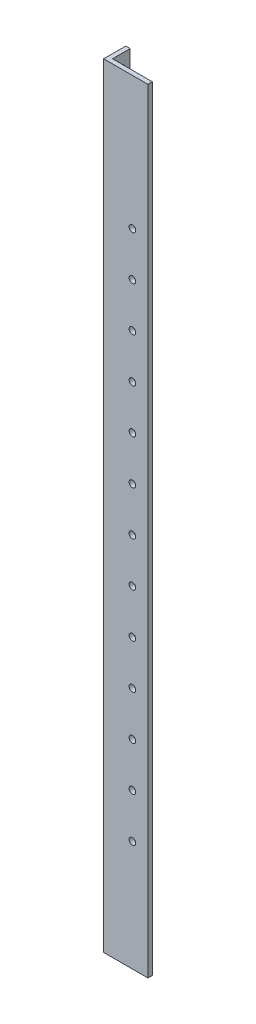
ISO-10303-21;
HEADER;
FILE_DESCRIPTION(('STEP AP214'),'2;1');
FILE_NAME('part.step','',(''),(''),'','','');
FILE_SCHEMA(('AUTOMOTIVE_DESIGN { 1 0 10303 214 1 1 1 1 }'));
ENDSEC;
DATA;
#1=APPLICATION_CONTEXT('core data for automotive mechanical design processes');
#2=APPLICATION_PROTOCOL_DEFINITION('international standard','automotive_design',2000,#1);
#3=PRODUCT_CONTEXT('',#1,'mechanical');
#4=PRODUCT('Part','Part','',(#3));
#5=PRODUCT_RELATED_PRODUCT_CATEGORY('part','',(#4));
#6=PRODUCT_DEFINITION_FORMATION('','',#4);
#7=PRODUCT_DEFINITION_CONTEXT('part definition',#1,'design');
#8=PRODUCT_DEFINITION('design','',#6,#7);
#9=PRODUCT_DEFINITION_SHAPE('','',#8);
#10=(LENGTH_UNIT() NAMED_UNIT(*) SI_UNIT(.MILLI.,.METRE.));
#11=(NAMED_UNIT(*) PLANE_ANGLE_UNIT() SI_UNIT($,.RADIAN.));
#12=(NAMED_UNIT(*) SI_UNIT($,.STERADIAN.) SOLID_ANGLE_UNIT());
#13=UNCERTAINTY_MEASURE_WITH_UNIT(LENGTH_MEASURE(1.E-05),#10,'distance_accuracy_value','');
#14=(GEOMETRIC_REPRESENTATION_CONTEXT(3) GLOBAL_UNCERTAINTY_ASSIGNED_CONTEXT((#13)) GLOBAL_UNIT_ASSIGNED_CONTEXT((#10,
#11,#12)) REPRESENTATION_CONTEXT('',''));
#15=CARTESIAN_POINT('',(0.,0.,0.));
#16=DIRECTION('',(0.,0.,1.));
#17=DIRECTION('',(1.,0.,0.));
#18=AXIS2_PLACEMENT_3D('',#15,#16,#17);
#19=CARTESIAN_POINT('',(20.,350.,0.));
#20=DIRECTION('',(0.,0.,-1.));
#21=DIRECTION('',(-1.,0.,0.));
#22=AXIS2_PLACEMENT_3D('',#19,#20,#21);
#23=PLANE('',#22);
#24=CARTESIAN_POINT('',(12.9999999863213,50.,0.));
#25=DIRECTION('',(0.,0.,1.));
#26=DIRECTION('',(1.,0.,0.));
#27=AXIS2_PLACEMENT_3D('',#24,#25,#26);
#28=CIRCLE('',#27,1.5);
#29=CARTESIAN_POINT('',(14.4999999863213,50.,0.));
#30=VERTEX_POINT('',#29);
#31=EDGE_CURVE('E243',#30,#30,#28,.T.);
#32=ORIENTED_EDGE('',*,*,#31,.F.);
#33=EDGE_LOOP('',(#32));
#34=FACE_BOUND('',#33,.T.);
#35=CARTESIAN_POINT('',(12.9999999863213,70.,0.));
#36=DIRECTION('',(0.,0.,1.));
#37=DIRECTION('',(1.,0.,0.));
#38=AXIS2_PLACEMENT_3D('',#35,#36,#37);
#39=CIRCLE('',#38,1.5);
#40=CARTESIAN_POINT('',(14.4999999863213,70.,0.));
#41=VERTEX_POINT('',#40);
#42=EDGE_CURVE('E247',#41,#41,#39,.T.);
#43=ORIENTED_EDGE('',*,*,#42,.F.);
#44=EDGE_LOOP('',(#43));
#45=FACE_BOUND('',#44,.T.);
#46=CARTESIAN_POINT('',(12.9999999863213,90.0000000000001,0.));
#47=DIRECTION('',(0.,0.,1.));
#48=DIRECTION('',(1.,0.,0.));
#49=AXIS2_PLACEMENT_3D('',#46,#47,#48);
#50=CIRCLE('',#49,1.5);
#51=CARTESIAN_POINT('',(14.4999999863213,90.0000000000001,0.));
#52=VERTEX_POINT('',#51);
#53=EDGE_CURVE('E251',#52,#52,#50,.T.);
#54=ORIENTED_EDGE('',*,*,#53,.F.);
#55=EDGE_LOOP('',(#54));
#56=FACE_BOUND('',#55,.T.);
#57=CARTESIAN_POINT('',(12.9999999863213,130.,0.));
#58=DIRECTION('',(0.,0.,1.));
#59=DIRECTION('',(1.,0.,0.));
#60=AXIS2_PLACEMENT_3D('',#57,#58,#59);
#61=CIRCLE('',#60,1.5);
#62=CARTESIAN_POINT('',(14.4999999863213,130.,0.));
#63=VERTEX_POINT('',#62);
#64=EDGE_CURVE('E255',#63,#63,#61,.T.);
#65=ORIENTED_EDGE('',*,*,#64,.F.);
#66=EDGE_LOOP('',(#65));
#67=FACE_BOUND('',#66,.T.);
#68=CARTESIAN_POINT('',(12.9999999863213,190.,0.));
#69=DIRECTION('',(0.,0.,1.));
#70=DIRECTION('',(1.,0.,0.));
#71=AXIS2_PLACEMENT_3D('',#68,#69,#70);
#72=CIRCLE('',#71,1.5);
#73=CARTESIAN_POINT('',(14.4999999863213,190.,0.));
#74=VERTEX_POINT('',#73);
#75=EDGE_CURVE('E259',#74,#74,#72,.T.);
#76=ORIENTED_EDGE('',*,*,#75,.F.);
#77=EDGE_LOOP('',(#76));
#78=FACE_BOUND('',#77,.T.);
#79=CARTESIAN_POINT('',(12.9999999863213,110.,0.));
#80=DIRECTION('',(0.,0.,1.));
#81=DIRECTION('',(1.,0.,0.));
#82=AXIS2_PLACEMENT_3D('',#79,#80,#81);
#83=CIRCLE('',#82,1.5);
#84=CARTESIAN_POINT('',(14.4999999863213,110.,0.));
#85=VERTEX_POINT('',#84);
#86=EDGE_CURVE('E263',#85,#85,#83,.T.);
#87=ORIENTED_EDGE('',*,*,#86,.F.);
#88=EDGE_LOOP('',(#87));
#89=FACE_BOUND('',#88,.T.);
#90=CARTESIAN_POINT('',(12.9999999863213,150.,0.));
#91=DIRECTION('',(0.,0.,1.));
#92=DIRECTION('',(1.,0.,0.));
#93=AXIS2_PLACEMENT_3D('',#90,#91,#92);
#94=CIRCLE('',#93,1.5);
#95=CARTESIAN_POINT('',(14.4999999863213,150.,0.));
#96=VERTEX_POINT('',#95);
#97=EDGE_CURVE('E188',#96,#96,#94,.T.);
#98=ORIENTED_EDGE('',*,*,#97,.F.);
#99=EDGE_LOOP('',(#98));
#100=FACE_BOUND('',#99,.T.);
#101=CARTESIAN_POINT('',(12.9999999863213,170.,0.));
#102=DIRECTION('',(0.,0.,1.));
#103=DIRECTION('',(1.,0.,0.));
#104=AXIS2_PLACEMENT_3D('',#101,#102,#103);
#105=CIRCLE('',#104,1.5);
#106=CARTESIAN_POINT('',(14.4999999863213,170.,0.));
#107=VERTEX_POINT('',#106);
#108=EDGE_CURVE('E270',#107,#107,#105,.T.);
#109=ORIENTED_EDGE('',*,*,#108,.F.);
#110=EDGE_LOOP('',(#109));
#111=FACE_BOUND('',#110,.T.);
#112=CARTESIAN_POINT('',(12.9999999863213,210.,0.));
#113=DIRECTION('',(0.,0.,1.));
#114=DIRECTION('',(1.,0.,0.));
#115=AXIS2_PLACEMENT_3D('',#112,#113,#114);
#116=CIRCLE('',#115,1.5);
#117=CARTESIAN_POINT('',(14.4999999863213,210.,0.));
#118=VERTEX_POINT('',#117);
#119=EDGE_CURVE('E274',#118,#118,#116,.T.);
#120=ORIENTED_EDGE('',*,*,#119,.F.);
#121=EDGE_LOOP('',(#120));
#122=FACE_BOUND('',#121,.T.);
#123=CARTESIAN_POINT('',(12.9999999863213,230.,0.));
#124=DIRECTION('',(0.,0.,1.));
#125=DIRECTION('',(1.,0.,0.));
#126=AXIS2_PLACEMENT_3D('',#123,#124,#125);
#127=CIRCLE('',#126,1.5);
#128=CARTESIAN_POINT('',(14.4999999863213,230.,0.));
#129=VERTEX_POINT('',#128);
#130=EDGE_CURVE('E278',#129,#129,#127,.T.);
#131=ORIENTED_EDGE('',*,*,#130,.F.);
#132=EDGE_LOOP('',(#131));
#133=FACE_BOUND('',#132,.T.);
#134=CARTESIAN_POINT('',(12.9999999863213,250.,0.));
#135=DIRECTION('',(0.,0.,1.));
#136=DIRECTION('',(1.,0.,0.));
#137=AXIS2_PLACEMENT_3D('',#134,#135,#136);
#138=CIRCLE('',#137,1.5);
#139=CARTESIAN_POINT('',(14.4999999863213,250.,0.));
#140=VERTEX_POINT('',#139);
#141=EDGE_CURVE('E282',#140,#140,#138,.T.);
#142=ORIENTED_EDGE('',*,*,#141,.F.);
#143=EDGE_LOOP('',(#142));
#144=FACE_BOUND('',#143,.T.);
#145=CARTESIAN_POINT('',(12.9999999863213,270.,0.));
#146=DIRECTION('',(0.,0.,1.));
#147=DIRECTION('',(1.,0.,0.));
#148=AXIS2_PLACEMENT_3D('',#145,#146,#147);
#149=CIRCLE('',#148,1.5);
#150=CARTESIAN_POINT('',(14.4999999863213,270.,0.));
#151=VERTEX_POINT('',#150);
#152=EDGE_CURVE('E149',#151,#151,#149,.T.);
#153=ORIENTED_EDGE('',*,*,#152,.F.);
#154=EDGE_LOOP('',(#153));
#155=FACE_BOUND('',#154,.T.);
#156=CARTESIAN_POINT('',(12.9999999863213,290.,0.));
#157=DIRECTION('',(0.,0.,1.));
#158=DIRECTION('',(1.,0.,0.));
#159=AXIS2_PLACEMENT_3D('',#156,#157,#158);
#160=CIRCLE('',#159,1.5);
#161=CARTESIAN_POINT('',(14.4999999863213,290.,0.));
#162=VERTEX_POINT('',#161);
#163=EDGE_CURVE('E144',#162,#162,#160,.T.);
#164=ORIENTED_EDGE('',*,*,#163,.F.);
#165=EDGE_LOOP('',(#164));
#166=FACE_BOUND('',#165,.T.);
#167=DIRECTION('',(1.,0.,0.));
#168=VECTOR('',#167,1.);
#169=CARTESIAN_POINT('',(20.,0.,0.));
#170=LINE('',#169,#168);
#171=CARTESIAN_POINT('',(0.,0.,0.));
#172=VERTEX_POINT('',#171);
#173=CARTESIAN_POINT('',(20.,0.,0.));
#174=VERTEX_POINT('',#173);
#175=EDGE_CURVE('E123',#172,#174,#170,.T.);
#176=ORIENTED_EDGE('',*,*,#175,.T.);
#177=DIRECTION('',(0.,-1.,0.));
#178=VECTOR('',#177,1.);
#179=CARTESIAN_POINT('',(20.,350.,0.));
#180=LINE('',#179,#178);
#181=CARTESIAN_POINT('',(20.,350.,0.));
#182=VERTEX_POINT('',#181);
#183=EDGE_CURVE('E11',#182,#174,#180,.T.);
#184=ORIENTED_EDGE('',*,*,#183,.F.);
#185=DIRECTION('',(1.,0.,0.));
#186=VECTOR('',#185,1.);
#187=CARTESIAN_POINT('',(20.,350.,0.));
#188=LINE('',#187,#186);
#189=CARTESIAN_POINT('',(0.,350.,0.));
#190=VERTEX_POINT('',#189);
#191=EDGE_CURVE('E134',#190,#182,#188,.T.);
#192=ORIENTED_EDGE('',*,*,#191,.F.);
#193=DIRECTION('',(0.,-1.,0.));
#194=VECTOR('',#193,1.);
#195=CARTESIAN_POINT('',(0.,350.,0.));
#196=LINE('',#195,#194);
#197=EDGE_CURVE('E119',#190,#172,#196,.T.);
#198=ORIENTED_EDGE('',*,*,#197,.T.);
#199=EDGE_LOOP('',(#176,#184,#192,#198));
#200=FACE_BOUND('',#199,.T.);
#201=ADVANCED_FACE('F37',(#34,#45,#56,#67,#78,#89,#100,#111,#122,#133,#144,#155,#166,#200),#23,.F.);
#202=CARTESIAN_POINT('',(20.,350.,-2.));
#203=DIRECTION('',(-1.,0.,0.));
#204=DIRECTION('',(0.,0.,1.));
#205=AXIS2_PLACEMENT_3D('',#202,#203,#204);
#206=PLANE('',#205);
#207=DIRECTION('',(0.,0.,-1.));
#208=VECTOR('',#207,1.);
#209=CARTESIAN_POINT('',(20.,0.,-2.));
#210=LINE('',#209,#208);
#211=CARTESIAN_POINT('',(20.,0.,-2.));
#212=VERTEX_POINT('',#211);
#213=EDGE_CURVE('E126',#174,#212,#210,.T.);
#214=ORIENTED_EDGE('',*,*,#213,.T.);
#215=DIRECTION('',(0.,-1.,0.));
#216=VECTOR('',#215,1.);
#217=CARTESIAN_POINT('',(20.,350.,-2.));
#218=LINE('',#217,#216);
#219=CARTESIAN_POINT('',(20.,350.,-2.));
#220=VERTEX_POINT('',#219);
#221=EDGE_CURVE('E46',#220,#212,#218,.T.);
#222=ORIENTED_EDGE('',*,*,#221,.F.);
#223=DIRECTION('',(0.,0.,-1.));
#224=VECTOR('',#223,1.);
#225=CARTESIAN_POINT('',(20.,350.,-2.));
#226=LINE('',#225,#224);
#227=EDGE_CURVE('E92',#182,#220,#226,.T.);
#228=ORIENTED_EDGE('',*,*,#227,.F.);
#229=ORIENTED_EDGE('',*,*,#183,.T.);
#230=EDGE_LOOP('',(#214,#222,#228,#229));
#231=FACE_BOUND('',#230,.T.);
#232=ADVANCED_FACE('F215',(#231),#206,.F.);
#233=CARTESIAN_POINT('',(2.,350.,-2.));
#234=DIRECTION('',(0.,0.,1.));
#235=DIRECTION('',(1.,0.,0.));
#236=AXIS2_PLACEMENT_3D('',#233,#234,#235);
#237=PLANE('',#236);
#238=CARTESIAN_POINT('',(12.9999999863213,50.,-2.));
#239=DIRECTION('',(0.,0.,1.));
#240=DIRECTION('',(1.,0.,0.));
#241=AXIS2_PLACEMENT_3D('',#238,#239,#240);
#242=CIRCLE('',#241,1.5);
#243=CARTESIAN_POINT('',(14.4999999863213,50.,-2.));
#244=VERTEX_POINT('',#243);
#245=EDGE_CURVE('E40',#244,#244,#242,.T.);
#246=ORIENTED_EDGE('',*,*,#245,.T.);
#247=EDGE_LOOP('',(#246));
#248=FACE_BOUND('',#247,.T.);
#249=CARTESIAN_POINT('',(12.9999999863213,70.,-2.));
#250=DIRECTION('',(0.,0.,1.));
#251=DIRECTION('',(1.,0.,0.));
#252=AXIS2_PLACEMENT_3D('',#249,#250,#251);
#253=CIRCLE('',#252,1.5);
#254=CARTESIAN_POINT('',(14.4999999863213,70.,-2.));
#255=VERTEX_POINT('',#254);
#256=EDGE_CURVE('E175',#255,#255,#253,.T.);
#257=ORIENTED_EDGE('',*,*,#256,.T.);
#258=EDGE_LOOP('',(#257));
#259=FACE_BOUND('',#258,.T.);
#260=CARTESIAN_POINT('',(12.9999999863213,90.0000000000001,-2.));
#261=DIRECTION('',(0.,0.,1.));
#262=DIRECTION('',(1.,0.,0.));
#263=AXIS2_PLACEMENT_3D('',#260,#261,#262);
#264=CIRCLE('',#263,1.5);
#265=CARTESIAN_POINT('',(14.4999999863213,90.0000000000001,-2.));
#266=VERTEX_POINT('',#265);
#267=EDGE_CURVE('E173',#266,#266,#264,.T.);
#268=ORIENTED_EDGE('',*,*,#267,.T.);
#269=EDGE_LOOP('',(#268));
#270=FACE_BOUND('',#269,.T.);
#271=CARTESIAN_POINT('',(12.9999999863213,130.,-2.));
#272=DIRECTION('',(0.,0.,1.));
#273=DIRECTION('',(1.,0.,0.));
#274=AXIS2_PLACEMENT_3D('',#271,#272,#273);
#275=CIRCLE('',#274,1.5);
#276=CARTESIAN_POINT('',(14.4999999863213,130.,-2.));
#277=VERTEX_POINT('',#276);
#278=EDGE_CURVE('E170',#277,#277,#275,.T.);
#279=ORIENTED_EDGE('',*,*,#278,.T.);
#280=EDGE_LOOP('',(#279));
#281=FACE_BOUND('',#280,.T.);
#282=CARTESIAN_POINT('',(12.9999999863213,190.,-2.));
#283=DIRECTION('',(0.,0.,1.));
#284=DIRECTION('',(1.,0.,0.));
#285=AXIS2_PLACEMENT_3D('',#282,#283,#284);
#286=CIRCLE('',#285,1.5);
#287=CARTESIAN_POINT('',(14.4999999863213,190.,-2.));
#288=VERTEX_POINT('',#287);
#289=EDGE_CURVE('E167',#288,#288,#286,.T.);
#290=ORIENTED_EDGE('',*,*,#289,.T.);
#291=EDGE_LOOP('',(#290));
#292=FACE_BOUND('',#291,.T.);
#293=CARTESIAN_POINT('',(12.9999999863213,110.,-2.));
#294=DIRECTION('',(0.,0.,1.));
#295=DIRECTION('',(1.,0.,0.));
#296=AXIS2_PLACEMENT_3D('',#293,#294,#295);
#297=CIRCLE('',#296,1.5);
#298=CARTESIAN_POINT('',(14.4999999863213,110.,-2.));
#299=VERTEX_POINT('',#298);
#300=EDGE_CURVE('E164',#299,#299,#297,.T.);
#301=ORIENTED_EDGE('',*,*,#300,.T.);
#302=EDGE_LOOP('',(#301));
#303=FACE_BOUND('',#302,.T.);
#304=CARTESIAN_POINT('',(12.9999999863213,150.,-2.));
#305=DIRECTION('',(0.,0.,1.));
#306=DIRECTION('',(1.,0.,0.));
#307=AXIS2_PLACEMENT_3D('',#304,#305,#306);
#308=CIRCLE('',#307,1.5);
#309=CARTESIAN_POINT('',(14.4999999863213,150.,-2.));
#310=VERTEX_POINT('',#309);
#311=EDGE_CURVE('E161',#310,#310,#308,.T.);
#312=ORIENTED_EDGE('',*,*,#311,.T.);
#313=EDGE_LOOP('',(#312));
#314=FACE_BOUND('',#313,.T.);
#315=CARTESIAN_POINT('',(12.9999999863213,170.,-2.));
#316=DIRECTION('',(0.,0.,1.));
#317=DIRECTION('',(1.,0.,0.));
#318=AXIS2_PLACEMENT_3D('',#315,#316,#317);
#319=CIRCLE('',#318,1.5);
#320=CARTESIAN_POINT('',(14.4999999863213,170.,-2.));
#321=VERTEX_POINT('',#320);
#322=EDGE_CURVE('E158',#321,#321,#319,.T.);
#323=ORIENTED_EDGE('',*,*,#322,.T.);
#324=EDGE_LOOP('',(#323));
#325=FACE_BOUND('',#324,.T.);
#326=CARTESIAN_POINT('',(12.9999999863213,210.,-2.));
#327=DIRECTION('',(0.,0.,1.));
#328=DIRECTION('',(1.,0.,0.));
#329=AXIS2_PLACEMENT_3D('',#326,#327,#328);
#330=CIRCLE('',#329,1.5);
#331=CARTESIAN_POINT('',(14.4999999863213,210.,-2.));
#332=VERTEX_POINT('',#331);
#333=EDGE_CURVE('E155',#332,#332,#330,.T.);
#334=ORIENTED_EDGE('',*,*,#333,.T.);
#335=EDGE_LOOP('',(#334));
#336=FACE_BOUND('',#335,.T.);
#337=CARTESIAN_POINT('',(12.9999999863213,230.,-2.));
#338=DIRECTION('',(0.,0.,1.));
#339=DIRECTION('',(1.,0.,0.));
#340=AXIS2_PLACEMENT_3D('',#337,#338,#339);
#341=CIRCLE('',#340,1.5);
#342=CARTESIAN_POINT('',(14.4999999863213,230.,-2.));
#343=VERTEX_POINT('',#342);
#344=EDGE_CURVE('E152',#343,#343,#341,.T.);
#345=ORIENTED_EDGE('',*,*,#344,.T.);
#346=EDGE_LOOP('',(#345));
#347=FACE_BOUND('',#346,.T.);
#348=CARTESIAN_POINT('',(12.9999999863213,250.,-2.));
#349=DIRECTION('',(0.,0.,1.));
#350=DIRECTION('',(1.,0.,0.));
#351=AXIS2_PLACEMENT_3D('',#348,#349,#350);
#352=CIRCLE('',#351,1.5);
#353=CARTESIAN_POINT('',(14.4999999863213,250.,-2.));
#354=VERTEX_POINT('',#353);
#355=EDGE_CURVE('E148',#354,#354,#352,.T.);
#356=ORIENTED_EDGE('',*,*,#355,.T.);
#357=EDGE_LOOP('',(#356));
#358=FACE_BOUND('',#357,.T.);
#359=CARTESIAN_POINT('',(12.9999999863213,270.,-2.));
#360=DIRECTION('',(0.,0.,1.));
#361=DIRECTION('',(1.,0.,0.));
#362=AXIS2_PLACEMENT_3D('',#359,#360,#361);
#363=CIRCLE('',#362,1.5);
#364=CARTESIAN_POINT('',(14.4999999863213,270.,-2.));
#365=VERTEX_POINT('',#364);
#366=EDGE_CURVE('E145',#365,#365,#363,.T.);
#367=ORIENTED_EDGE('',*,*,#366,.T.);
#368=EDGE_LOOP('',(#367));
#369=FACE_BOUND('',#368,.T.);
#370=CARTESIAN_POINT('',(12.9999999863213,290.,-2.));
#371=DIRECTION('',(0.,0.,1.));
#372=DIRECTION('',(1.,0.,0.));
#373=AXIS2_PLACEMENT_3D('',#370,#371,#372);
#374=CIRCLE('',#373,1.5);
#375=CARTESIAN_POINT('',(14.4999999863213,290.,-2.));
#376=VERTEX_POINT('',#375);
#377=EDGE_CURVE('E140',#376,#376,#374,.T.);
#378=ORIENTED_EDGE('',*,*,#377,.T.);
#379=EDGE_LOOP('',(#378));
#380=FACE_BOUND('',#379,.T.);
#381=DIRECTION('',(-1.,0.,0.));
#382=VECTOR('',#381,1.);
#383=CARTESIAN_POINT('',(2.,0.,-2.));
#384=LINE('',#383,#382);
#385=CARTESIAN_POINT('',(2.,0.,-2.));
#386=VERTEX_POINT('',#385);
#387=EDGE_CURVE('E129',#212,#386,#384,.T.);
#388=ORIENTED_EDGE('',*,*,#387,.T.);
#389=DIRECTION('',(0.,-1.,0.));
#390=VECTOR('',#389,1.);
#391=CARTESIAN_POINT('',(2.,350.,-2.));
#392=LINE('',#391,#390);
#393=CARTESIAN_POINT('',(2.,350.,-2.));
#394=VERTEX_POINT('',#393);
#395=EDGE_CURVE('E114',#394,#386,#392,.T.);
#396=ORIENTED_EDGE('',*,*,#395,.F.);
#397=DIRECTION('',(-1.,0.,0.));
#398=VECTOR('',#397,1.);
#399=CARTESIAN_POINT('',(2.,350.,-2.));
#400=LINE('',#399,#398);
#401=EDGE_CURVE('E105',#220,#394,#400,.T.);
#402=ORIENTED_EDGE('',*,*,#401,.F.);
#403=ORIENTED_EDGE('',*,*,#221,.T.);
#404=EDGE_LOOP('',(#388,#396,#402,#403));
#405=FACE_BOUND('',#404,.T.);
#406=ADVANCED_FACE('F218',(#248,#259,#270,#281,#292,#303,#314,#325,#336,#347,#358,#369,#380,
#405),#237,.F.);
#407=CARTESIAN_POINT('',(2.,350.,-10.));
#408=DIRECTION('',(-1.,0.,0.));
#409=DIRECTION('',(0.,0.,1.));
#410=AXIS2_PLACEMENT_3D('',#407,#408,#409);
#411=PLANE('',#410);
#412=CARTESIAN_POINT('',(2.,344.,-5.99999999999998));
#413=DIRECTION('',(1.,0.,0.));
#414=DIRECTION('',(0.,0.,-1.));
#415=AXIS2_PLACEMENT_3D('',#412,#413,#414);
#416=CIRCLE('',#415,1.5);
#417=CARTESIAN_POINT('',(2.,344.,-7.49999999999998));
#418=VERTEX_POINT('',#417);
#419=EDGE_CURVE('E143',#418,#418,#416,.T.);
#420=ORIENTED_EDGE('',*,*,#419,.F.);
#421=EDGE_LOOP('',(#420));
#422=FACE_BOUND('',#421,.T.);
#423=CARTESIAN_POINT('',(2.,330.,-5.99999999999998));
#424=DIRECTION('',(1.,0.,0.));
#425=DIRECTION('',(0.,0.,-1.));
#426=AXIS2_PLACEMENT_3D('',#423,#424,#425);
#427=CIRCLE('',#426,1.5);
#428=CARTESIAN_POINT('',(2.,330.,-7.49999999999998));
#429=VERTEX_POINT('',#428);
#430=EDGE_CURVE('E195',#429,#429,#427,.T.);
#431=ORIENTED_EDGE('',*,*,#430,.F.);
#432=EDGE_LOOP('',(#431));
#433=FACE_BOUND('',#432,.T.);
#434=CARTESIAN_POINT('',(2.,5.99999999999999,-5.99999999999998));
#435=DIRECTION('',(1.,0.,0.));
#436=DIRECTION('',(0.,0.,-1.));
#437=AXIS2_PLACEMENT_3D('',#434,#435,#436);
#438=CIRCLE('',#437,1.49999999999999);
#439=CARTESIAN_POINT('',(2.,5.99999999999999,-7.49999999999997));
#440=VERTEX_POINT('',#439);
#441=EDGE_CURVE('E201',#440,#440,#438,.T.);
#442=ORIENTED_EDGE('',*,*,#441,.F.);
#443=EDGE_LOOP('',(#442));
#444=FACE_BOUND('',#443,.T.);
#445=CARTESIAN_POINT('',(2.,20.,-5.99999999999998));
#446=DIRECTION('',(1.,0.,0.));
#447=DIRECTION('',(0.,0.,-1.));
#448=AXIS2_PLACEMENT_3D('',#445,#446,#447);
#449=CIRCLE('',#448,1.49999999999999);
#450=CARTESIAN_POINT('',(2.,20.,-7.49999999999997));
#451=VERTEX_POINT('',#450);
#452=EDGE_CURVE('E207',#451,#451,#449,.T.);
#453=ORIENTED_EDGE('',*,*,#452,.F.);
#454=EDGE_LOOP('',(#453));
#455=FACE_BOUND('',#454,.T.);
#456=DIRECTION('',(0.,0.,-1.));
#457=VECTOR('',#456,1.);
#458=CARTESIAN_POINT('',(2.,0.,-10.));
#459=LINE('',#458,#457);
#460=CARTESIAN_POINT('',(2.,0.,-10.));
#461=VERTEX_POINT('',#460);
#462=EDGE_CURVE('E113',#386,#461,#459,.T.);
#463=ORIENTED_EDGE('',*,*,#462,.T.);
#464=DIRECTION('',(0.,-1.,0.));
#465=VECTOR('',#464,1.);
#466=CARTESIAN_POINT('',(2.,350.,-10.));
#467=LINE('',#466,#465);
#468=CARTESIAN_POINT('',(2.,350.,-10.));
#469=VERTEX_POINT('',#468);
#470=EDGE_CURVE('E110',#469,#461,#467,.T.);
#471=ORIENTED_EDGE('',*,*,#470,.F.);
#472=DIRECTION('',(0.,0.,-1.));
#473=VECTOR('',#472,1.);
#474=CARTESIAN_POINT('',(2.,350.,-10.));
#475=LINE('',#474,#473);
#476=EDGE_CURVE('E99',#394,#469,#475,.T.);
#477=ORIENTED_EDGE('',*,*,#476,.F.);
#478=ORIENTED_EDGE('',*,*,#395,.T.);
#479=EDGE_LOOP('',(#463,#471,#477,#478));
#480=FACE_BOUND('',#479,.T.);
#481=ADVANCED_FACE('F111',(#422,#433,#444,#455,#480),#411,.F.);
#482=CARTESIAN_POINT('',(0.,350.,-10.));
#483=DIRECTION('',(0.,0.,1.));
#484=DIRECTION('',(1.,0.,0.));
#485=AXIS2_PLACEMENT_3D('',#482,#483,#484);
#486=PLANE('',#485);
#487=DIRECTION('',(-1.,0.,0.));
#488=VECTOR('',#487,1.);
#489=CARTESIAN_POINT('',(0.,0.,-10.));
#490=LINE('',#489,#488);
#491=CARTESIAN_POINT('',(0.,0.,-10.));
#492=VERTEX_POINT('',#491);
#493=EDGE_CURVE('E78',#461,#492,#490,.T.);
#494=ORIENTED_EDGE('',*,*,#493,.T.);
#495=DIRECTION('',(0.,-1.,0.));
#496=VECTOR('',#495,1.);
#497=CARTESIAN_POINT('',(0.,350.,-10.));
#498=LINE('',#497,#496);
#499=CARTESIAN_POINT('',(0.,350.,-10.));
#500=VERTEX_POINT('',#499);
#501=EDGE_CURVE('E115',#500,#492,#498,.T.);
#502=ORIENTED_EDGE('',*,*,#501,.F.);
#503=DIRECTION('',(-1.,0.,0.));
#504=VECTOR('',#503,1.);
#505=CARTESIAN_POINT('',(0.,350.,-10.));
#506=LINE('',#505,#504);
#507=EDGE_CURVE('E103',#469,#500,#506,.T.);
#508=ORIENTED_EDGE('',*,*,#507,.F.);
#509=ORIENTED_EDGE('',*,*,#470,.T.);
#510=EDGE_LOOP('',(#494,#502,#508,#509));
#511=FACE_BOUND('',#510,.T.);
#512=ADVANCED_FACE('F117',(#511),#486,.F.);
#513=CARTESIAN_POINT('',(0.,350.,0.));
#514=DIRECTION('',(1.,0.,0.));
#515=DIRECTION('',(0.,0.,-1.));
#516=AXIS2_PLACEMENT_3D('',#513,#514,#515);
#517=PLANE('',#516);
#518=CARTESIAN_POINT('',(0.,344.,-5.99999999999998));
#519=DIRECTION('',(1.,0.,0.));
#520=DIRECTION('',(0.,0.,-1.));
#521=AXIS2_PLACEMENT_3D('',#518,#519,#520);
#522=CIRCLE('',#521,1.5);
#523=CARTESIAN_POINT('',(0.,344.,-7.49999999999998));
#524=VERTEX_POINT('',#523);
#525=EDGE_CURVE('E192',#524,#524,#522,.T.);
#526=ORIENTED_EDGE('',*,*,#525,.T.);
#527=EDGE_LOOP('',(#526));
#528=FACE_BOUND('',#527,.T.);
#529=CARTESIAN_POINT('',(0.,330.,-5.99999999999998));
#530=DIRECTION('',(1.,0.,0.));
#531=DIRECTION('',(0.,0.,-1.));
#532=AXIS2_PLACEMENT_3D('',#529,#530,#531);
#533=CIRCLE('',#532,1.5);
#534=CARTESIAN_POINT('',(0.,330.,-7.49999999999998));
#535=VERTEX_POINT('',#534);
#536=EDGE_CURVE('E198',#535,#535,#533,.T.);
#537=ORIENTED_EDGE('',*,*,#536,.T.);
#538=EDGE_LOOP('',(#537));
#539=FACE_BOUND('',#538,.T.);
#540=CARTESIAN_POINT('',(0.,5.99999999999999,-5.99999999999998));
#541=DIRECTION('',(1.,0.,0.));
#542=DIRECTION('',(0.,0.,-1.));
#543=AXIS2_PLACEMENT_3D('',#540,#541,#542);
#544=CIRCLE('',#543,1.49999999999999);
#545=CARTESIAN_POINT('',(0.,5.99999999999999,-7.49999999999997));
#546=VERTEX_POINT('',#545);
#547=EDGE_CURVE('E204',#546,#546,#544,.T.);
#548=ORIENTED_EDGE('',*,*,#547,.T.);
#549=EDGE_LOOP('',(#548));
#550=FACE_BOUND('',#549,.T.);
#551=CARTESIAN_POINT('',(0.,20.,-5.99999999999998));
#552=DIRECTION('',(1.,0.,0.));
#553=DIRECTION('',(0.,0.,-1.));
#554=AXIS2_PLACEMENT_3D('',#551,#552,#553);
#555=CIRCLE('',#554,1.49999999999999);
#556=CARTESIAN_POINT('',(0.,20.,-7.49999999999997));
#557=VERTEX_POINT('',#556);
#558=EDGE_CURVE('E127',#557,#557,#555,.T.);
#559=ORIENTED_EDGE('',*,*,#558,.T.);
#560=EDGE_LOOP('',(#559));
#561=FACE_BOUND('',#560,.T.);
#562=DIRECTION('',(0.,0.,1.));
#563=VECTOR('',#562,1.);
#564=CARTESIAN_POINT('',(0.,0.,0.));
#565=LINE('',#564,#563);
#566=EDGE_CURVE('E84',#492,#172,#565,.T.);
#567=ORIENTED_EDGE('',*,*,#566,.T.);
#568=ORIENTED_EDGE('',*,*,#197,.F.);
#569=DIRECTION('',(0.,0.,1.));
#570=VECTOR('',#569,1.);
#571=CARTESIAN_POINT('',(0.,350.,0.));
#572=LINE('',#571,#570);
#573=EDGE_CURVE('E55',#500,#190,#572,.T.);
#574=ORIENTED_EDGE('',*,*,#573,.F.);
#575=ORIENTED_EDGE('',*,*,#501,.T.);
#576=EDGE_LOOP('',(#567,#568,#574,#575));
#577=FACE_BOUND('',#576,.T.);
#578=ADVANCED_FACE('F223',(#528,#539,#550,#561,#577),#517,.F.);
#579=CARTESIAN_POINT('',(0.,350.,0.));
#580=DIRECTION('',(0.,-1.,0.));
#581=DIRECTION('',(0.,0.,-1.));
#582=AXIS2_PLACEMENT_3D('',#579,#580,#581);
#583=PLANE('',#582);
#584=ORIENTED_EDGE('',*,*,#191,.T.);
#585=ORIENTED_EDGE('',*,*,#227,.T.);
#586=ORIENTED_EDGE('',*,*,#401,.T.);
#587=ORIENTED_EDGE('',*,*,#476,.T.);
#588=ORIENTED_EDGE('',*,*,#507,.T.);
#589=ORIENTED_EDGE('',*,*,#573,.T.);
#590=EDGE_LOOP('',(#584,#585,#586,#587,#588,#589));
#591=FACE_BOUND('',#590,.T.);
#592=ADVANCED_FACE('F101',(#591),#583,.F.);
#593=CARTESIAN_POINT('',(0.,0.,0.));
#594=DIRECTION('',(0.,-1.,0.));
#595=DIRECTION('',(0.,0.,-1.));
#596=AXIS2_PLACEMENT_3D('',#593,#594,#595);
#597=PLANE('',#596);
#598=ORIENTED_EDGE('',*,*,#175,.F.);
#599=ORIENTED_EDGE('',*,*,#566,.F.);
#600=ORIENTED_EDGE('',*,*,#493,.F.);
#601=ORIENTED_EDGE('',*,*,#462,.F.);
#602=ORIENTED_EDGE('',*,*,#387,.F.);
#603=ORIENTED_EDGE('',*,*,#213,.F.);
#604=EDGE_LOOP('',(#598,#599,#600,#601,#602,#603));
#605=FACE_BOUND('',#604,.T.);
#606=ADVANCED_FACE('F221',(#605),#597,.T.);
#607=CARTESIAN_POINT('',(2.,20.,-5.99999999999998));
#608=DIRECTION('',(1.,0.,0.));
#609=DIRECTION('',(0.,0.,-1.));
#610=AXIS2_PLACEMENT_3D('',#607,#608,#609);
#611=CYLINDRICAL_SURFACE('',#610,1.49999999999999);
#612=ORIENTED_EDGE('',*,*,#558,.F.);
#613=EDGE_LOOP('',(#612));
#614=FACE_BOUND('',#613,.T.);
#615=ORIENTED_EDGE('',*,*,#452,.T.);
#616=EDGE_LOOP('',(#615));
#617=FACE_BOUND('',#616,.T.);
#618=ADVANCED_FACE('F350',(#614,#617),#611,.F.);
#619=CARTESIAN_POINT('',(2.,5.99999999999999,-5.99999999999998));
#620=DIRECTION('',(1.,0.,0.));
#621=DIRECTION('',(0.,0.,-1.));
#622=AXIS2_PLACEMENT_3D('',#619,#620,#621);
#623=CYLINDRICAL_SURFACE('',#622,1.49999999999999);
#624=ORIENTED_EDGE('',*,*,#547,.F.);
#625=EDGE_LOOP('',(#624));
#626=FACE_BOUND('',#625,.T.);
#627=ORIENTED_EDGE('',*,*,#441,.T.);
#628=EDGE_LOOP('',(#627));
#629=FACE_BOUND('',#628,.T.);
#630=ADVANCED_FACE('F346',(#626,#629),#623,.F.);
#631=CARTESIAN_POINT('',(2.,330.,-5.99999999999998));
#632=DIRECTION('',(1.,0.,0.));
#633=DIRECTION('',(0.,0.,-1.));
#634=AXIS2_PLACEMENT_3D('',#631,#632,#633);
#635=CYLINDRICAL_SURFACE('',#634,1.5);
#636=ORIENTED_EDGE('',*,*,#536,.F.);
#637=EDGE_LOOP('',(#636));
#638=FACE_BOUND('',#637,.T.);
#639=ORIENTED_EDGE('',*,*,#430,.T.);
#640=EDGE_LOOP('',(#639));
#641=FACE_BOUND('',#640,.T.);
#642=ADVANCED_FACE('F342',(#638,#641),#635,.F.);
#643=CARTESIAN_POINT('',(2.,344.,-5.99999999999998));
#644=DIRECTION('',(1.,0.,0.));
#645=DIRECTION('',(0.,0.,-1.));
#646=AXIS2_PLACEMENT_3D('',#643,#644,#645);
#647=CYLINDRICAL_SURFACE('',#646,1.5);
#648=ORIENTED_EDGE('',*,*,#525,.F.);
#649=EDGE_LOOP('',(#648));
#650=FACE_BOUND('',#649,.T.);
#651=ORIENTED_EDGE('',*,*,#419,.T.);
#652=EDGE_LOOP('',(#651));
#653=FACE_BOUND('',#652,.T.);
#654=ADVANCED_FACE('F339',(#650,#653),#647,.F.);
#655=CARTESIAN_POINT('',(12.9999999863213,290.,-10.));
#656=DIRECTION('',(0.,0.,1.));
#657=DIRECTION('',(1.,0.,0.));
#658=AXIS2_PLACEMENT_3D('',#655,#656,#657);
#659=CYLINDRICAL_SURFACE('',#658,1.5);
#660=ORIENTED_EDGE('',*,*,#163,.T.);
#661=EDGE_LOOP('',(#660));
#662=FACE_BOUND('',#661,.T.);
#663=ORIENTED_EDGE('',*,*,#377,.F.);
#664=EDGE_LOOP('',(#663));
#665=FACE_BOUND('',#664,.T.);
#666=ADVANCED_FACE('F318',(#662,#665),#659,.F.);
#667=CARTESIAN_POINT('',(12.9999999863213,270.,-10.));
#668=DIRECTION('',(0.,0.,1.));
#669=DIRECTION('',(1.,0.,0.));
#670=AXIS2_PLACEMENT_3D('',#667,#668,#669);
#671=CYLINDRICAL_SURFACE('',#670,1.5);
#672=ORIENTED_EDGE('',*,*,#152,.T.);
#673=EDGE_LOOP('',(#672));
#674=FACE_BOUND('',#673,.T.);
#675=ORIENTED_EDGE('',*,*,#366,.F.);
#676=EDGE_LOOP('',(#675));
#677=FACE_BOUND('',#676,.T.);
#678=ADVANCED_FACE('F314',(#674,#677),#671,.F.);
#679=CARTESIAN_POINT('',(12.9999999863213,250.,-10.));
#680=DIRECTION('',(0.,0.,1.));
#681=DIRECTION('',(1.,0.,0.));
#682=AXIS2_PLACEMENT_3D('',#679,#680,#681);
#683=CYLINDRICAL_SURFACE('',#682,1.5);
#684=ORIENTED_EDGE('',*,*,#141,.T.);
#685=EDGE_LOOP('',(#684));
#686=FACE_BOUND('',#685,.T.);
#687=ORIENTED_EDGE('',*,*,#355,.F.);
#688=EDGE_LOOP('',(#687));
#689=FACE_BOUND('',#688,.T.);
#690=ADVANCED_FACE('F317',(#686,#689),#683,.F.);
#691=CARTESIAN_POINT('',(12.9999999863213,230.,-10.));
#692=DIRECTION('',(0.,0.,1.));
#693=DIRECTION('',(1.,0.,0.));
#694=AXIS2_PLACEMENT_3D('',#691,#692,#693);
#695=CYLINDRICAL_SURFACE('',#694,1.5);
#696=ORIENTED_EDGE('',*,*,#130,.T.);
#697=EDGE_LOOP('',(#696));
#698=FACE_BOUND('',#697,.T.);
#699=ORIENTED_EDGE('',*,*,#344,.F.);
#700=EDGE_LOOP('',(#699));
#701=FACE_BOUND('',#700,.T.);
#702=ADVANCED_FACE('F321',(#698,#701),#695,.F.);
#703=CARTESIAN_POINT('',(12.9999999863213,210.,-10.));
#704=DIRECTION('',(0.,0.,1.));
#705=DIRECTION('',(1.,0.,0.));
#706=AXIS2_PLACEMENT_3D('',#703,#704,#705);
#707=CYLINDRICAL_SURFACE('',#706,1.5);
#708=ORIENTED_EDGE('',*,*,#119,.T.);
#709=EDGE_LOOP('',(#708));
#710=FACE_BOUND('',#709,.T.);
#711=ORIENTED_EDGE('',*,*,#333,.F.);
#712=EDGE_LOOP('',(#711));
#713=FACE_BOUND('',#712,.T.);
#714=ADVANCED_FACE('F325',(#710,#713),#707,.F.);
#715=CARTESIAN_POINT('',(12.9999999863213,170.,-10.));
#716=DIRECTION('',(0.,0.,1.));
#717=DIRECTION('',(1.,0.,0.));
#718=AXIS2_PLACEMENT_3D('',#715,#716,#717);
#719=CYLINDRICAL_SURFACE('',#718,1.5);
#720=ORIENTED_EDGE('',*,*,#108,.T.);
#721=EDGE_LOOP('',(#720));
#722=FACE_BOUND('',#721,.T.);
#723=ORIENTED_EDGE('',*,*,#322,.F.);
#724=EDGE_LOOP('',(#723));
#725=FACE_BOUND('',#724,.T.);
#726=ADVANCED_FACE('F329',(#722,#725),#719,.F.);
#727=CARTESIAN_POINT('',(12.9999999863213,150.,-10.));
#728=DIRECTION('',(0.,0.,1.));
#729=DIRECTION('',(1.,0.,0.));
#730=AXIS2_PLACEMENT_3D('',#727,#728,#729);
#731=CYLINDRICAL_SURFACE('',#730,1.5);
#732=ORIENTED_EDGE('',*,*,#97,.T.);
#733=EDGE_LOOP('',(#732));
#734=FACE_BOUND('',#733,.T.);
#735=ORIENTED_EDGE('',*,*,#311,.F.);
#736=EDGE_LOOP('',(#735));
#737=FACE_BOUND('',#736,.T.);
#738=ADVANCED_FACE('F333',(#734,#737),#731,.F.);
#739=CARTESIAN_POINT('',(12.9999999863213,110.,-10.));
#740=DIRECTION('',(0.,0.,1.));
#741=DIRECTION('',(1.,0.,0.));
#742=AXIS2_PLACEMENT_3D('',#739,#740,#741);
#743=CYLINDRICAL_SURFACE('',#742,1.5);
#744=ORIENTED_EDGE('',*,*,#86,.T.);
#745=EDGE_LOOP('',(#744));
#746=FACE_BOUND('',#745,.T.);
#747=ORIENTED_EDGE('',*,*,#300,.F.);
#748=EDGE_LOOP('',(#747));
#749=FACE_BOUND('',#748,.T.);
#750=ADVANCED_FACE('F336',(#746,#749),#743,.F.);
#751=CARTESIAN_POINT('',(12.9999999863213,190.,-10.));
#752=DIRECTION('',(0.,0.,1.));
#753=DIRECTION('',(1.,0.,0.));
#754=AXIS2_PLACEMENT_3D('',#751,#752,#753);
#755=CYLINDRICAL_SURFACE('',#754,1.5);
#756=ORIENTED_EDGE('',*,*,#75,.T.);
#757=EDGE_LOOP('',(#756));
#758=FACE_BOUND('',#757,.T.);
#759=ORIENTED_EDGE('',*,*,#289,.F.);
#760=EDGE_LOOP('',(#759));
#761=FACE_BOUND('',#760,.T.);
#762=ADVANCED_FACE('F411',(#758,#761),#755,.F.);
#763=CARTESIAN_POINT('',(12.9999999863213,130.,-10.));
#764=DIRECTION('',(0.,0.,1.));
#765=DIRECTION('',(1.,0.,0.));
#766=AXIS2_PLACEMENT_3D('',#763,#764,#765);
#767=CYLINDRICAL_SURFACE('',#766,1.5);
#768=ORIENTED_EDGE('',*,*,#64,.T.);
#769=EDGE_LOOP('',(#768));
#770=FACE_BOUND('',#769,.T.);
#771=ORIENTED_EDGE('',*,*,#278,.F.);
#772=EDGE_LOOP('',(#771));
#773=FACE_BOUND('',#772,.T.);
#774=ADVANCED_FACE('F419',(#770,#773),#767,.F.);
#775=CARTESIAN_POINT('',(12.9999999863213,90.0000000000001,-10.));
#776=DIRECTION('',(0.,0.,1.));
#777=DIRECTION('',(1.,0.,0.));
#778=AXIS2_PLACEMENT_3D('',#775,#776,#777);
#779=CYLINDRICAL_SURFACE('',#778,1.5);
#780=ORIENTED_EDGE('',*,*,#53,.T.);
#781=EDGE_LOOP('',(#780));
#782=FACE_BOUND('',#781,.T.);
#783=ORIENTED_EDGE('',*,*,#267,.F.);
#784=EDGE_LOOP('',(#783));
#785=FACE_BOUND('',#784,.T.);
#786=ADVANCED_FACE('F310',(#782,#785),#779,.F.);
#787=CARTESIAN_POINT('',(12.9999999863213,70.,-10.));
#788=DIRECTION('',(0.,0.,1.));
#789=DIRECTION('',(1.,0.,0.));
#790=AXIS2_PLACEMENT_3D('',#787,#788,#789);
#791=CYLINDRICAL_SURFACE('',#790,1.5);
#792=ORIENTED_EDGE('',*,*,#42,.T.);
#793=EDGE_LOOP('',(#792));
#794=FACE_BOUND('',#793,.T.);
#795=ORIENTED_EDGE('',*,*,#256,.F.);
#796=EDGE_LOOP('',(#795));
#797=FACE_BOUND('',#796,.T.);
#798=ADVANCED_FACE('F305',(#794,#797),#791,.F.);
#799=CARTESIAN_POINT('',(12.9999999863213,50.,-10.));
#800=DIRECTION('',(0.,0.,1.));
#801=DIRECTION('',(1.,0.,0.));
#802=AXIS2_PLACEMENT_3D('',#799,#800,#801);
#803=CYLINDRICAL_SURFACE('',#802,1.5);
#804=ORIENTED_EDGE('',*,*,#31,.T.);
#805=EDGE_LOOP('',(#804));
#806=FACE_BOUND('',#805,.T.);
#807=ORIENTED_EDGE('',*,*,#245,.F.);
#808=EDGE_LOOP('',(#807));
#809=FACE_BOUND('',#808,.T.);
#810=ADVANCED_FACE('F302',(#806,#809),#803,.F.);
#811=CLOSED_SHELL('',(#201,#232,#406,#481,#512,#578,#592,#606,#618,#630,#642,#654,#666,#678,
#690,#702,#714,#726,#738,#750,#762,#774,#786,#798,#810));
#812=MANIFOLD_SOLID_BREP('B2',#811);
#813=ADVANCED_BREP_SHAPE_REPRESENTATION('',(#18,#812),#14);
#814=SHAPE_DEFINITION_REPRESENTATION(#9,#813);
ENDSEC;
END-ISO-10303-21;
